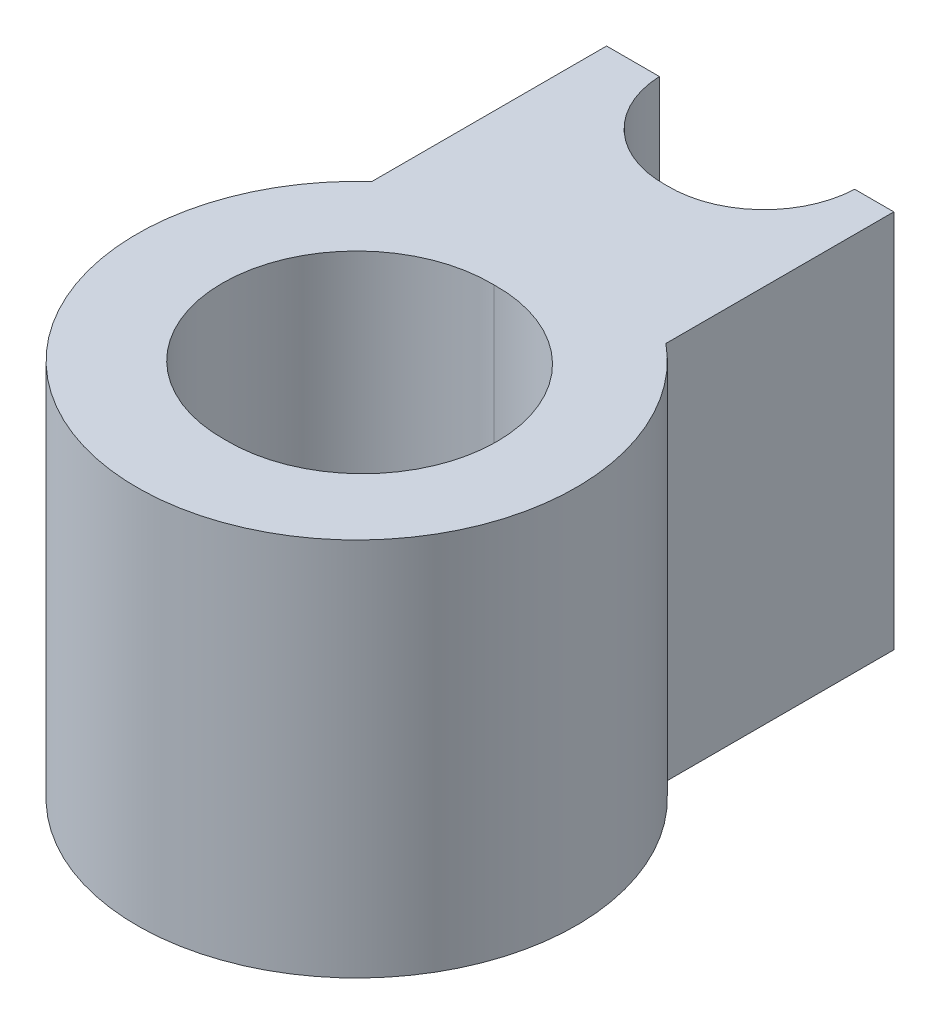
ISO-10303-21;
HEADER;
FILE_DESCRIPTION(('STEP AP214'),'2;1');
FILE_NAME('part.step','',(''),(''),'','','');
FILE_SCHEMA(('AUTOMOTIVE_DESIGN { 1 0 10303 214 1 1 1 1 }'));
ENDSEC;
DATA;
#1=APPLICATION_CONTEXT('core data for automotive mechanical design processes');
#2=APPLICATION_PROTOCOL_DEFINITION('international standard','automotive_design',2000,#1);
#3=PRODUCT_CONTEXT('',#1,'mechanical');
#4=PRODUCT('Part','Part','',(#3));
#5=PRODUCT_RELATED_PRODUCT_CATEGORY('part','',(#4));
#6=PRODUCT_DEFINITION_FORMATION('','',#4);
#7=PRODUCT_DEFINITION_CONTEXT('part definition',#1,'design');
#8=PRODUCT_DEFINITION('design','',#6,#7);
#9=PRODUCT_DEFINITION_SHAPE('','',#8);
#10=(LENGTH_UNIT() NAMED_UNIT(*) SI_UNIT(.MILLI.,.METRE.));
#11=(NAMED_UNIT(*) PLANE_ANGLE_UNIT() SI_UNIT($,.RADIAN.));
#12=(NAMED_UNIT(*) SI_UNIT($,.STERADIAN.) SOLID_ANGLE_UNIT());
#13=UNCERTAINTY_MEASURE_WITH_UNIT(LENGTH_MEASURE(1.E-05),#10,'distance_accuracy_value','');
#14=(GEOMETRIC_REPRESENTATION_CONTEXT(3) GLOBAL_UNCERTAINTY_ASSIGNED_CONTEXT((#13)) GLOBAL_UNIT_ASSIGNED_CONTEXT((#10,
#11,#12)) REPRESENTATION_CONTEXT('',''));
#15=CARTESIAN_POINT('',(0.,0.,0.));
#16=DIRECTION('',(0.,0.,1.));
#17=DIRECTION('',(1.,0.,0.));
#18=AXIS2_PLACEMENT_3D('',#15,#16,#17);
#19=CARTESIAN_POINT('',(1.26536763995187,2.87183105039429,15.59112871048));
#20=DIRECTION('',(0.,1.,0.));
#21=DIRECTION('',(0.,0.,-1.));
#22=AXIS2_PLACEMENT_3D('',#19,#20,#21);
#23=PLANE('',#22);
#24=CARTESIAN_POINT('',(-1.36353236004812,2.87183105039428,7.9584287104753));
#25=DIRECTION('',(0.,1.,0.));
#26=DIRECTION('',(0.,0.,1.));
#27=AXIS2_PLACEMENT_3D('',#24,#25,#26);
#28=CIRCLE('',#27,0.425);
#29=CARTESIAN_POINT('',(-1.37276547480987,2.87183105039428,8.38332840404059));
#30=VERTEX_POINT('',#29);
#31=CARTESIAN_POINT('',(-1.37276547480987,2.87183105039428,7.53352901691001));
#32=VERTEX_POINT('',#31);
#33=EDGE_CURVE('E157',#30,#32,#28,.T.);
#34=ORIENTED_EDGE('',*,*,#33,.F.);
#35=CARTESIAN_POINT('',(-1.38199858956762,2.87183105039428,7.9584287104753));
#36=DIRECTION('',(0.,1.,0.));
#37=DIRECTION('',(0.,0.,1.));
#38=AXIS2_PLACEMENT_3D('',#35,#36,#37);
#39=CIRCLE('',#38,0.425);
#40=EDGE_CURVE('E186',#32,#30,#39,.T.);
#41=ORIENTED_EDGE('',*,*,#40,.F.);
#42=EDGE_LOOP('',(#34,#41));
#43=FACE_BOUND('',#42,.T.);
#44=DIRECTION('',(-5.02522919053297E-13,0.,1.));
#45=VECTOR('',#44,1.);
#46=CARTESIAN_POINT('',(-1.84881339345026,2.87183105039428,6.70112871047543));
#47=LINE('',#46,#45);
#48=CARTESIAN_POINT('',(-1.84881339345026,2.87183105039428,6.70112871047543));
#49=VERTEX_POINT('',#48);
#50=CARTESIAN_POINT('',(-1.84881339345063,2.87183105039428,7.44378108328629));
#51=VERTEX_POINT('',#50);
#52=EDGE_CURVE('E171',#49,#51,#47,.T.);
#53=ORIENTED_EDGE('',*,*,#52,.T.);
#54=CARTESIAN_POINT('',(-1.38199858956762,2.87183105039428,7.9584287104753));
#55=DIRECTION('',(0.,1.,0.));
#56=DIRECTION('',(0.,0.,1.));
#57=AXIS2_PLACEMENT_3D('',#54,#55,#56);
#58=CIRCLE('',#57,0.694822453073876);
#59=CARTESIAN_POINT('',(-0.940119500688147,2.87183105039428,7.42221875895757));
#60=VERTEX_POINT('',#59);
#61=EDGE_CURVE('E114',#51,#60,#58,.T.);
#62=ORIENTED_EDGE('',*,*,#61,.T.);
#63=DIRECTION('',(5.6636748734305E-13,0.,1.));
#64=VECTOR('',#63,1.);
#65=CARTESIAN_POINT('',(-0.940119500688555,2.87183105039428,6.70112871047504));
#66=LINE('',#65,#64);
#67=CARTESIAN_POINT('',(-0.940119500688555,2.87183105039428,6.70112871047504));
#68=VERTEX_POINT('',#67);
#69=EDGE_CURVE('E26',#68,#60,#66,.T.);
#70=ORIENTED_EDGE('',*,*,#69,.F.);
#71=DIRECTION('',(-1.,0.,1.62432664225037E-12));
#72=VECTOR('',#71,1.);
#73=CARTESIAN_POINT('',(-0.940119500688555,2.87183105039428,6.70112871047504));
#74=LINE('',#73,#72);
#75=CARTESIAN_POINT('',(-1.06380129724814,2.87183105039428,6.70112871047524));
#76=VERTEX_POINT('',#75);
#77=EDGE_CURVE('E11',#68,#76,#74,.T.);
#78=ORIENTED_EDGE('',*,*,#77,.T.);
#79=CARTESIAN_POINT('',(-1.36353236004814,2.87183105039428,6.68842871047527));
#80=DIRECTION('',(0.,1.,0.));
#81=DIRECTION('',(-0.999103542626009,0.,0.0423333333457055));
#82=AXIS2_PLACEMENT_3D('',#79,#80,#81);
#83=CIRCLE('',#82,0.299999999999993);
#84=CARTESIAN_POINT('',(-1.37276547480804,2.87183105039428,6.98828659279926));
#85=VERTEX_POINT('',#84);
#86=EDGE_CURVE('E146',#85,#76,#83,.T.);
#87=ORIENTED_EDGE('',*,*,#86,.F.);
#88=CARTESIAN_POINT('',(-1.38199858956764,2.87183105039428,6.68842871047527));
#89=DIRECTION('',(0.,1.,0.));
#90=DIRECTION('',(-0.999103542626486,0.,0.0423333333344553));
#91=AXIS2_PLACEMENT_3D('',#88,#89,#90);
#92=CIRCLE('',#91,0.299999999999992);
#93=CARTESIAN_POINT('',(-1.68172965235557,2.87183105039428,6.70112871047561));
#94=VERTEX_POINT('',#93);
#95=EDGE_CURVE('E175',#94,#85,#92,.T.);
#96=ORIENTED_EDGE('',*,*,#95,.F.);
#97=DIRECTION('',(1.,0.,1.06337566312106E-12));
#98=VECTOR('',#97,1.);
#99=CARTESIAN_POINT('',(-1.84881339345026,2.87183105039428,6.70112871047543));
#100=LINE('',#99,#98);
#101=EDGE_CURVE('E172',#49,#94,#100,.T.);
#102=ORIENTED_EDGE('',*,*,#101,.F.);
#103=EDGE_LOOP('',(#53,#62,#70,#78,#87,#96,#102));
#104=FACE_BOUND('',#103,.T.);
#105=ADVANCED_FACE('F17',(#43,#104),#23,.T.);
#106=CARTESIAN_POINT('',(-1.06380129724814,2.87183105039428,6.70112871047524));
#107=DIRECTION('',(-1.62432664225037E-12,0.,-1.));
#108=DIRECTION('',(-1.,0.,1.62432664225037E-12));
#109=AXIS2_PLACEMENT_3D('',#106,#107,#108);
#110=PLANE('',#109);
#111=DIRECTION('',(-1.,0.,1.62432664225037E-12));
#112=VECTOR('',#111,1.);
#113=CARTESIAN_POINT('',(0.10078317134465,1.6718310055699,6.70112871047334));
#114=LINE('',#113,#112);
#115=CARTESIAN_POINT('',(-0.940119500688547,1.6718310055699,6.70112871047504));
#116=VERTEX_POINT('',#115);
#117=CARTESIAN_POINT('',(-1.06380129724813,1.6718310055699,6.70112871047524));
#118=VERTEX_POINT('',#117);
#119=EDGE_CURVE('E111',#116,#118,#114,.T.);
#120=ORIENTED_EDGE('',*,*,#119,.T.);
#121=DIRECTION('',(0.,-1.,0.));
#122=VECTOR('',#121,1.);
#123=CARTESIAN_POINT('',(-1.06380129724814,2.87183105039428,6.70112871047524));
#124=LINE('',#123,#122);
#125=EDGE_CURVE('E164',#76,#118,#124,.T.);
#126=ORIENTED_EDGE('',*,*,#125,.F.);
#127=ORIENTED_EDGE('',*,*,#77,.F.);
#128=DIRECTION('',(0.,-1.,0.));
#129=VECTOR('',#128,1.);
#130=CARTESIAN_POINT('',(-0.940119500688555,2.87183105039428,6.70112871047504));
#131=LINE('',#130,#129);
#132=EDGE_CURVE('E108',#68,#116,#131,.T.);
#133=ORIENTED_EDGE('',*,*,#132,.T.);
#134=EDGE_LOOP('',(#120,#126,#127,#133));
#135=FACE_BOUND('',#134,.T.);
#136=ADVANCED_FACE('F19',(#135),#110,.T.);
#137=CARTESIAN_POINT('',(-0.940119500688555,2.87183105039428,6.70112871047504));
#138=DIRECTION('',(1.,0.,-5.6636748734305E-13));
#139=DIRECTION('',(-5.6636748734305E-13,0.,-1.));
#140=AXIS2_PLACEMENT_3D('',#137,#138,#139);
#141=PLANE('',#140);
#142=DIRECTION('',(-5.6636748734305E-13,0.,-1.));
#143=VECTOR('',#142,1.);
#144=CARTESIAN_POINT('',(-0.940119500686038,1.6718310055699,11.1461287104782));
#145=LINE('',#144,#143);
#146=CARTESIAN_POINT('',(-0.940119500688139,1.6718310055699,7.42221875895757));
#147=VERTEX_POINT('',#146);
#148=EDGE_CURVE('E117',#147,#116,#145,.T.);
#149=ORIENTED_EDGE('',*,*,#148,.T.);
#150=ORIENTED_EDGE('',*,*,#132,.F.);
#151=ORIENTED_EDGE('',*,*,#69,.T.);
#152=DIRECTION('',(0.,-1.,0.));
#153=VECTOR('',#152,1.);
#154=CARTESIAN_POINT('',(-0.940119500688147,2.87183105039428,7.42221875895757));
#155=LINE('',#154,#153);
#156=EDGE_CURVE('E120',#60,#147,#155,.T.);
#157=ORIENTED_EDGE('',*,*,#156,.T.);
#158=EDGE_LOOP('',(#149,#150,#151,#157));
#159=FACE_BOUND('',#158,.T.);
#160=ADVANCED_FACE('F118',(#159),#141,.T.);
#161=CARTESIAN_POINT('',(-1.38199858956762,2.87183105039428,7.9584287104753));
#162=DIRECTION('',(0.,-1.,0.));
#163=DIRECTION('',(0.,0.,1.));
#164=AXIS2_PLACEMENT_3D('',#161,#162,#163);
#165=CYLINDRICAL_SURFACE('',#164,0.694822453073876);
#166=CARTESIAN_POINT('',(-1.38199858956762,1.6718310055699,7.9584287104753));
#167=DIRECTION('',(0.,1.,0.));
#168=DIRECTION('',(0.,0.,1.));
#169=AXIS2_PLACEMENT_3D('',#166,#167,#168);
#170=CIRCLE('',#169,0.694822453073876);
#171=CARTESIAN_POINT('',(-1.84881339345062,1.6718310055699,7.44378108328629));
#172=VERTEX_POINT('',#171);
#173=EDGE_CURVE('E125',#172,#147,#170,.T.);
#174=ORIENTED_EDGE('',*,*,#173,.T.);
#175=ORIENTED_EDGE('',*,*,#156,.F.);
#176=ORIENTED_EDGE('',*,*,#61,.F.);
#177=DIRECTION('',(0.,-1.,0.));
#178=VECTOR('',#177,1.);
#179=CARTESIAN_POINT('',(-1.84881339345063,2.87183105039428,7.44378108328629));
#180=LINE('',#179,#178);
#181=EDGE_CURVE('E168',#51,#172,#180,.T.);
#182=ORIENTED_EDGE('',*,*,#181,.T.);
#183=EDGE_LOOP('',(#174,#175,#176,#182));
#184=FACE_BOUND('',#183,.T.);
#185=ADVANCED_FACE('F296',(#184),#165,.T.);
#186=CARTESIAN_POINT('',(-1.38199858956762,2.87183105039428,7.9584287104753));
#187=DIRECTION('',(0.,-1.,0.));
#188=DIRECTION('',(-1.,0.,0.));
#189=AXIS2_PLACEMENT_3D('',#186,#187,#188);
#190=CYLINDRICAL_SURFACE('',#189,0.425);
#191=CARTESIAN_POINT('',(-1.38199858956762,1.6718310055699,7.9584287104753));
#192=DIRECTION('',(0.,-1.,0.));
#193=DIRECTION('',(0.,0.,1.));
#194=AXIS2_PLACEMENT_3D('',#191,#192,#193);
#195=CIRCLE('',#194,0.425);
#196=CARTESIAN_POINT('',(-1.37276547480986,1.6718310055699,8.38332840404059));
#197=VERTEX_POINT('',#196);
#198=CARTESIAN_POINT('',(-1.37276547480986,1.6718310055699,7.53352901691001));
#199=VERTEX_POINT('',#198);
#200=EDGE_CURVE('E151',#197,#199,#195,.T.);
#201=ORIENTED_EDGE('',*,*,#200,.T.);
#202=DIRECTION('',(0.,-1.,0.));
#203=VECTOR('',#202,1.);
#204=CARTESIAN_POINT('',(-1.37276547480987,2.87183105039428,7.53352901691001));
#205=LINE('',#204,#203);
#206=EDGE_CURVE('E147',#32,#199,#205,.T.);
#207=ORIENTED_EDGE('',*,*,#206,.F.);
#208=ORIENTED_EDGE('',*,*,#40,.T.);
#209=DIRECTION('',(0.,-1.,0.));
#210=VECTOR('',#209,1.);
#211=CARTESIAN_POINT('',(-1.37276547480987,2.87183105039428,8.38332840404059));
#212=LINE('',#211,#210);
#213=EDGE_CURVE('E155',#30,#197,#212,.T.);
#214=ORIENTED_EDGE('',*,*,#213,.T.);
#215=EDGE_LOOP('',(#201,#207,#208,#214));
#216=FACE_BOUND('',#215,.T.);
#217=ADVANCED_FACE('F330',(#216),#190,.F.);
#218=CARTESIAN_POINT('',(-1.84881339345063,2.87183105039428,7.44378108328629));
#219=DIRECTION('',(-1.,0.,-5.02522919053297E-13));
#220=DIRECTION('',(-5.02522919053297E-13,0.,1.));
#221=AXIS2_PLACEMENT_3D('',#218,#219,#220);
#222=PLANE('',#221);
#223=DIRECTION('',(-5.02522919053297E-13,0.,1.));
#224=VECTOR('',#223,1.);
#225=CARTESIAN_POINT('',(-1.84881339345268,1.6718310055699,11.5174548968824));
#226=LINE('',#225,#224);
#227=CARTESIAN_POINT('',(-1.84881339345025,1.6718310055699,6.70112871047543));
#228=VERTEX_POINT('',#227);
#229=EDGE_CURVE('E282',#228,#172,#226,.T.);
#230=ORIENTED_EDGE('',*,*,#229,.T.);
#231=ORIENTED_EDGE('',*,*,#181,.F.);
#232=ORIENTED_EDGE('',*,*,#52,.F.);
#233=DIRECTION('',(0.,-1.,0.));
#234=VECTOR('',#233,1.);
#235=CARTESIAN_POINT('',(-1.84881339345026,2.87183105039428,6.70112871047543));
#236=LINE('',#235,#234);
#237=EDGE_CURVE('E178',#49,#228,#236,.T.);
#238=ORIENTED_EDGE('',*,*,#237,.T.);
#239=EDGE_LOOP('',(#230,#231,#232,#238));
#240=FACE_BOUND('',#239,.T.);
#241=ADVANCED_FACE('F292',(#240),#222,.T.);
#242=CARTESIAN_POINT('',(-1.84881339345026,2.87183105039428,6.70112871047543));
#243=DIRECTION('',(1.06337566312106E-12,0.,-1.));
#244=DIRECTION('',(0.,-1.,0.));
#245=AXIS2_PLACEMENT_3D('',#242,#243,#244);
#246=PLANE('',#245);
#247=DIRECTION('',(-1.,0.,-1.06337566312106E-12));
#248=VECTOR('',#247,1.);
#249=CARTESIAN_POINT('',(-0.291722876744463,1.6718310055699,6.70112871047709));
#250=LINE('',#249,#248);
#251=CARTESIAN_POINT('',(-1.68172965235557,1.6718310055699,6.70112871047561));
#252=VERTEX_POINT('',#251);
#253=EDGE_CURVE('E275',#252,#228,#250,.T.);
#254=ORIENTED_EDGE('',*,*,#253,.T.);
#255=ORIENTED_EDGE('',*,*,#237,.F.);
#256=ORIENTED_EDGE('',*,*,#101,.T.);
#257=DIRECTION('',(0.,-1.,0.));
#258=VECTOR('',#257,1.);
#259=CARTESIAN_POINT('',(-1.68172965235557,2.87183105039428,6.70112871047561));
#260=LINE('',#259,#258);
#261=EDGE_CURVE('E167',#94,#252,#260,.T.);
#262=ORIENTED_EDGE('',*,*,#261,.T.);
#263=EDGE_LOOP('',(#254,#255,#256,#262));
#264=FACE_BOUND('',#263,.T.);
#265=ADVANCED_FACE('F303',(#264),#246,.T.);
#266=CARTESIAN_POINT('',(-1.38199858956764,2.87183105039428,6.68842871047527));
#267=DIRECTION('',(0.,-1.,0.));
#268=DIRECTION('',(-0.999103542626486,0.,0.0423333333344553));
#269=AXIS2_PLACEMENT_3D('',#266,#267,#268);
#270=CYLINDRICAL_SURFACE('',#269,0.299999999999992);
#271=CARTESIAN_POINT('',(-1.38199858956764,1.6718310055699,6.68842871047527));
#272=DIRECTION('',(0.,-1.,0.));
#273=DIRECTION('',(-0.999103542626486,0.,0.0423333333344553));
#274=AXIS2_PLACEMENT_3D('',#271,#272,#273);
#275=CIRCLE('',#274,0.299999999999992);
#276=CARTESIAN_POINT('',(-1.37276547480803,1.6718310055699,6.98828659279926));
#277=VERTEX_POINT('',#276);
#278=EDGE_CURVE('E138',#277,#252,#275,.T.);
#279=ORIENTED_EDGE('',*,*,#278,.T.);
#280=ORIENTED_EDGE('',*,*,#261,.F.);
#281=ORIENTED_EDGE('',*,*,#95,.T.);
#282=DIRECTION('',(0.,-1.,0.));
#283=VECTOR('',#282,1.);
#284=CARTESIAN_POINT('',(-1.37276547480804,2.87183105039428,6.98828659279926));
#285=LINE('',#284,#283);
#286=EDGE_CURVE('E144',#85,#277,#285,.T.);
#287=ORIENTED_EDGE('',*,*,#286,.T.);
#288=EDGE_LOOP('',(#279,#280,#281,#287));
#289=FACE_BOUND('',#288,.T.);
#290=ADVANCED_FACE('F305',(#289),#270,.F.);
#291=CARTESIAN_POINT('',(-1.36353236004814,2.87183105039428,6.68842871047527));
#292=DIRECTION('',(0.,-1.,0.));
#293=DIRECTION('',(-0.999103542626009,0.,0.0423333333457054));
#294=AXIS2_PLACEMENT_3D('',#291,#292,#293);
#295=CYLINDRICAL_SURFACE('',#294,0.299999999999993);
#296=CARTESIAN_POINT('',(-1.36353236004814,1.6718310055699,6.68842871047527));
#297=DIRECTION('',(0.,-1.,0.));
#298=DIRECTION('',(-0.999103542626009,0.,0.0423333333457055));
#299=AXIS2_PLACEMENT_3D('',#296,#297,#298);
#300=CIRCLE('',#299,0.299999999999993);
#301=EDGE_CURVE('E131',#118,#277,#300,.T.);
#302=ORIENTED_EDGE('',*,*,#301,.T.);
#303=ORIENTED_EDGE('',*,*,#286,.F.);
#304=ORIENTED_EDGE('',*,*,#86,.T.);
#305=ORIENTED_EDGE('',*,*,#125,.T.);
#306=EDGE_LOOP('',(#302,#303,#304,#305));
#307=FACE_BOUND('',#306,.T.);
#308=ADVANCED_FACE('F308',(#307),#295,.F.);
#309=CARTESIAN_POINT('',(-1.36353236004812,2.87183105039428,7.9584287104753));
#310=DIRECTION('',(0.,-1.,0.));
#311=DIRECTION('',(1.,0.,0.));
#312=AXIS2_PLACEMENT_3D('',#309,#310,#311);
#313=CYLINDRICAL_SURFACE('',#312,0.425);
#314=CARTESIAN_POINT('',(-1.36353236004812,1.6718310055699,7.9584287104753));
#315=DIRECTION('',(0.,-1.,0.));
#316=DIRECTION('',(0.,0.,1.));
#317=AXIS2_PLACEMENT_3D('',#314,#315,#316);
#318=CIRCLE('',#317,0.425);
#319=EDGE_CURVE('E142',#199,#197,#318,.T.);
#320=ORIENTED_EDGE('',*,*,#319,.T.);
#321=ORIENTED_EDGE('',*,*,#213,.F.);
#322=ORIENTED_EDGE('',*,*,#33,.T.);
#323=ORIENTED_EDGE('',*,*,#206,.T.);
#324=EDGE_LOOP('',(#320,#321,#322,#323));
#325=FACE_BOUND('',#324,.T.);
#326=ADVANCED_FACE('F310',(#325),#313,.F.);
#327=CARTESIAN_POINT('',(1.26536763995188,1.6718310055699,15.59112871048));
#328=DIRECTION('',(0.,1.,0.));
#329=DIRECTION('',(0.,0.,-1.));
#330=AXIS2_PLACEMENT_3D('',#327,#328,#329);
#331=PLANE('',#330);
#332=ORIENTED_EDGE('',*,*,#319,.F.);
#333=ORIENTED_EDGE('',*,*,#200,.F.);
#334=EDGE_LOOP('',(#332,#333));
#335=FACE_BOUND('',#334,.T.);
#336=ORIENTED_EDGE('',*,*,#229,.F.);
#337=ORIENTED_EDGE('',*,*,#253,.F.);
#338=ORIENTED_EDGE('',*,*,#278,.F.);
#339=ORIENTED_EDGE('',*,*,#301,.F.);
#340=ORIENTED_EDGE('',*,*,#119,.F.);
#341=ORIENTED_EDGE('',*,*,#148,.F.);
#342=ORIENTED_EDGE('',*,*,#173,.F.);
#343=EDGE_LOOP('',(#336,#337,#338,#339,#340,#341,#342));
#344=FACE_BOUND('',#343,.T.);
#345=ADVANCED_FACE('F128',(#335,#344),#331,.F.);
#346=CLOSED_SHELL('',(#105,#136,#160,#185,#217,#241,#265,#290,#308,#326,#345));
#347=MANIFOLD_SOLID_BREP('B1',#346);
#348=ADVANCED_BREP_SHAPE_REPRESENTATION('',(#18,#347),#14);
#349=SHAPE_DEFINITION_REPRESENTATION(#9,#348);
ENDSEC;
END-ISO-10303-21;
